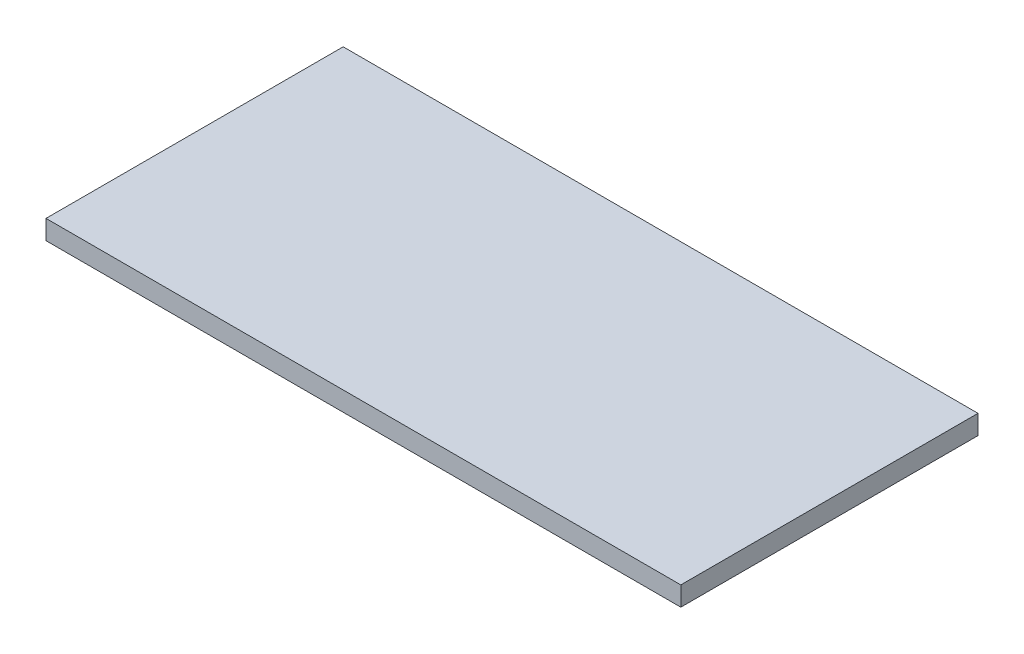
ISO-10303-21;
HEADER;
FILE_DESCRIPTION(('STEP AP214'),'2;1');
FILE_NAME('part.step','',(''),(''),'','','');
FILE_SCHEMA(('AUTOMOTIVE_DESIGN { 1 0 10303 214 1 1 1 1 }'));
ENDSEC;
DATA;
#1=APPLICATION_CONTEXT('core data for automotive mechanical design processes');
#2=APPLICATION_PROTOCOL_DEFINITION('international standard','automotive_design',2000,#1);
#3=PRODUCT_CONTEXT('',#1,'mechanical');
#4=PRODUCT('Part','Part','',(#3));
#5=PRODUCT_RELATED_PRODUCT_CATEGORY('part','',(#4));
#6=PRODUCT_DEFINITION_FORMATION('','',#4);
#7=PRODUCT_DEFINITION_CONTEXT('part definition',#1,'design');
#8=PRODUCT_DEFINITION('design','',#6,#7);
#9=PRODUCT_DEFINITION_SHAPE('','',#8);
#10=(LENGTH_UNIT() NAMED_UNIT(*) SI_UNIT(.MILLI.,.METRE.));
#11=(NAMED_UNIT(*) PLANE_ANGLE_UNIT() SI_UNIT($,.RADIAN.));
#12=(NAMED_UNIT(*) SI_UNIT($,.STERADIAN.) SOLID_ANGLE_UNIT());
#13=UNCERTAINTY_MEASURE_WITH_UNIT(LENGTH_MEASURE(1.E-05),#10,'distance_accuracy_value','');
#14=(GEOMETRIC_REPRESENTATION_CONTEXT(3) GLOBAL_UNCERTAINTY_ASSIGNED_CONTEXT((#13)) GLOBAL_UNIT_ASSIGNED_CONTEXT((#10,
#11,#12)) REPRESENTATION_CONTEXT('',''));
#15=CARTESIAN_POINT('',(0.,0.,0.));
#16=DIRECTION('',(0.,0.,1.));
#17=DIRECTION('',(1.,0.,0.));
#18=AXIS2_PLACEMENT_3D('',#15,#16,#17);
#19=CARTESIAN_POINT('',(164.218171640769,10.,-76.8780177817709));
#20=DIRECTION('',(-1.,0.,0.));
#21=DIRECTION('',(0.,0.,1.));
#22=AXIS2_PLACEMENT_3D('',#19,#20,#21);
#23=PLANE('',#22);
#24=DIRECTION('',(0.,0.,-1.));
#25=VECTOR('',#24,1.);
#26=CARTESIAN_POINT('',(164.218171640769,0.,-76.8780177817709));
#27=LINE('',#26,#25);
#28=CARTESIAN_POINT('',(164.218171640769,0.,76.8780177817709));
#29=VERTEX_POINT('',#28);
#30=CARTESIAN_POINT('',(164.218171640769,0.,-76.8780177817709));
#31=VERTEX_POINT('',#30);
#32=EDGE_CURVE('E100',#29,#31,#27,.T.);
#33=ORIENTED_EDGE('',*,*,#32,.T.);
#34=DIRECTION('',(0.,-1.,0.));
#35=VECTOR('',#34,1.);
#36=CARTESIAN_POINT('',(164.218171640769,10.,-76.8780177817709));
#37=LINE('',#36,#35);
#38=CARTESIAN_POINT('',(164.218171640769,10.,-76.8780177817709));
#39=VERTEX_POINT('',#38);
#40=EDGE_CURVE('E11',#39,#31,#37,.T.);
#41=ORIENTED_EDGE('',*,*,#40,.F.);
#42=DIRECTION('',(0.,0.,-1.));
#43=VECTOR('',#42,1.);
#44=CARTESIAN_POINT('',(164.218171640769,10.,-76.8780177817709));
#45=LINE('',#44,#43);
#46=CARTESIAN_POINT('',(164.218171640769,10.,76.8780177817709));
#47=VERTEX_POINT('',#46);
#48=EDGE_CURVE('E88',#47,#39,#45,.T.);
#49=ORIENTED_EDGE('',*,*,#48,.F.);
#50=DIRECTION('',(0.,-1.,0.));
#51=VECTOR('',#50,1.);
#52=CARTESIAN_POINT('',(164.218171640769,10.,76.8780177817709));
#53=LINE('',#52,#51);
#54=EDGE_CURVE('E96',#47,#29,#53,.T.);
#55=ORIENTED_EDGE('',*,*,#54,.T.);
#56=EDGE_LOOP('',(#33,#41,#49,#55));
#57=FACE_BOUND('',#56,.T.);
#58=ADVANCED_FACE('F37',(#57),#23,.F.);
#59=CARTESIAN_POINT('',(-164.218171640769,10.,-76.8780177817709));
#60=DIRECTION('',(0.,0.,1.));
#61=DIRECTION('',(1.,0.,0.));
#62=AXIS2_PLACEMENT_3D('',#59,#60,#61);
#63=PLANE('',#62);
#64=DIRECTION('',(-1.,0.,0.));
#65=VECTOR('',#64,1.);
#66=CARTESIAN_POINT('',(-164.218171640769,0.,-76.8780177817709));
#67=LINE('',#66,#65);
#68=CARTESIAN_POINT('',(-164.218171640769,0.,-76.8780177817709));
#69=VERTEX_POINT('',#68);
#70=EDGE_CURVE('E92',#31,#69,#67,.T.);
#71=ORIENTED_EDGE('',*,*,#70,.T.);
#72=DIRECTION('',(0.,-1.,0.));
#73=VECTOR('',#72,1.);
#74=CARTESIAN_POINT('',(-164.218171640769,10.,-76.8780177817709));
#75=LINE('',#74,#73);
#76=CARTESIAN_POINT('',(-164.218171640769,10.,-76.8780177817709));
#77=VERTEX_POINT('',#76);
#78=EDGE_CURVE('E45',#77,#69,#75,.T.);
#79=ORIENTED_EDGE('',*,*,#78,.F.);
#80=DIRECTION('',(-1.,0.,0.));
#81=VECTOR('',#80,1.);
#82=CARTESIAN_POINT('',(-164.218171640769,10.,-76.8780177817709));
#83=LINE('',#82,#81);
#84=EDGE_CURVE('E83',#39,#77,#83,.T.);
#85=ORIENTED_EDGE('',*,*,#84,.F.);
#86=ORIENTED_EDGE('',*,*,#40,.T.);
#87=EDGE_LOOP('',(#71,#79,#85,#86));
#88=FACE_BOUND('',#87,.T.);
#89=ADVANCED_FACE('F91',(#88),#63,.F.);
#90=CARTESIAN_POINT('',(-164.218171640769,10.,-76.8780177817709));
#91=DIRECTION('',(1.,0.,0.));
#92=DIRECTION('',(0.,0.,-1.));
#93=AXIS2_PLACEMENT_3D('',#90,#91,#92);
#94=PLANE('',#93);
#95=DIRECTION('',(0.,0.,1.));
#96=VECTOR('',#95,1.);
#97=CARTESIAN_POINT('',(-164.218171640769,0.,-76.8780177817709));
#98=LINE('',#97,#96);
#99=CARTESIAN_POINT('',(-164.218171640769,0.,76.8780177817709));
#100=VERTEX_POINT('',#99);
#101=EDGE_CURVE('E70',#69,#100,#98,.T.);
#102=ORIENTED_EDGE('',*,*,#101,.T.);
#103=DIRECTION('',(0.,-1.,0.));
#104=VECTOR('',#103,1.);
#105=CARTESIAN_POINT('',(-164.218171640769,10.,76.8780177817709));
#106=LINE('',#105,#104);
#107=CARTESIAN_POINT('',(-164.218171640769,10.,76.8780177817709));
#108=VERTEX_POINT('',#107);
#109=EDGE_CURVE('E93',#108,#100,#106,.T.);
#110=ORIENTED_EDGE('',*,*,#109,.F.);
#111=DIRECTION('',(0.,0.,1.));
#112=VECTOR('',#111,1.);
#113=CARTESIAN_POINT('',(-164.218171640769,10.,-76.8780177817709));
#114=LINE('',#113,#112);
#115=EDGE_CURVE('E86',#77,#108,#114,.T.);
#116=ORIENTED_EDGE('',*,*,#115,.F.);
#117=ORIENTED_EDGE('',*,*,#78,.T.);
#118=EDGE_LOOP('',(#102,#110,#116,#117));
#119=FACE_BOUND('',#118,.T.);
#120=ADVANCED_FACE('F94',(#119),#94,.F.);
#121=CARTESIAN_POINT('',(-164.218171640769,10.,76.8780177817709));
#122=DIRECTION('',(0.,0.,-1.));
#123=DIRECTION('',(-1.,0.,0.));
#124=AXIS2_PLACEMENT_3D('',#121,#122,#123);
#125=PLANE('',#124);
#126=DIRECTION('',(1.,0.,0.));
#127=VECTOR('',#126,1.);
#128=CARTESIAN_POINT('',(-164.218171640769,0.,76.8780177817709));
#129=LINE('',#128,#127);
#130=EDGE_CURVE('E76',#100,#29,#129,.T.);
#131=ORIENTED_EDGE('',*,*,#130,.T.);
#132=ORIENTED_EDGE('',*,*,#54,.F.);
#133=DIRECTION('',(1.,0.,0.));
#134=VECTOR('',#133,1.);
#135=CARTESIAN_POINT('',(-164.218171640769,10.,76.8780177817709));
#136=LINE('',#135,#134);
#137=EDGE_CURVE('E53',#108,#47,#136,.T.);
#138=ORIENTED_EDGE('',*,*,#137,.F.);
#139=ORIENTED_EDGE('',*,*,#109,.T.);
#140=EDGE_LOOP('',(#131,#132,#138,#139));
#141=FACE_BOUND('',#140,.T.);
#142=ADVANCED_FACE('F107',(#141),#125,.F.);
#143=CARTESIAN_POINT('',(0.,10.,0.));
#144=DIRECTION('',(0.,1.,0.));
#145=DIRECTION('',(0.,0.,1.));
#146=AXIS2_PLACEMENT_3D('',#143,#144,#145);
#147=PLANE('',#146);
#148=ORIENTED_EDGE('',*,*,#48,.T.);
#149=ORIENTED_EDGE('',*,*,#84,.T.);
#150=ORIENTED_EDGE('',*,*,#115,.T.);
#151=ORIENTED_EDGE('',*,*,#137,.T.);
#152=EDGE_LOOP('',(#148,#149,#150,#151));
#153=FACE_BOUND('',#152,.T.);
#154=ADVANCED_FACE('F84',(#153),#147,.T.);
#155=CARTESIAN_POINT('',(0.,0.,0.));
#156=DIRECTION('',(0.,1.,0.));
#157=DIRECTION('',(0.,0.,1.));
#158=AXIS2_PLACEMENT_3D('',#155,#156,#157);
#159=PLANE('',#158);
#160=ORIENTED_EDGE('',*,*,#32,.F.);
#161=ORIENTED_EDGE('',*,*,#130,.F.);
#162=ORIENTED_EDGE('',*,*,#101,.F.);
#163=ORIENTED_EDGE('',*,*,#70,.F.);
#164=EDGE_LOOP('',(#160,#161,#162,#163));
#165=FACE_BOUND('',#164,.T.);
#166=ADVANCED_FACE('F110',(#165),#159,.F.);
#167=CLOSED_SHELL('',(#58,#89,#120,#142,#154,#166));
#168=MANIFOLD_SOLID_BREP('B2',#167);
#169=ADVANCED_BREP_SHAPE_REPRESENTATION('',(#18,#168),#14);
#170=SHAPE_DEFINITION_REPRESENTATION(#9,#169);
ENDSEC;
END-ISO-10303-21;
